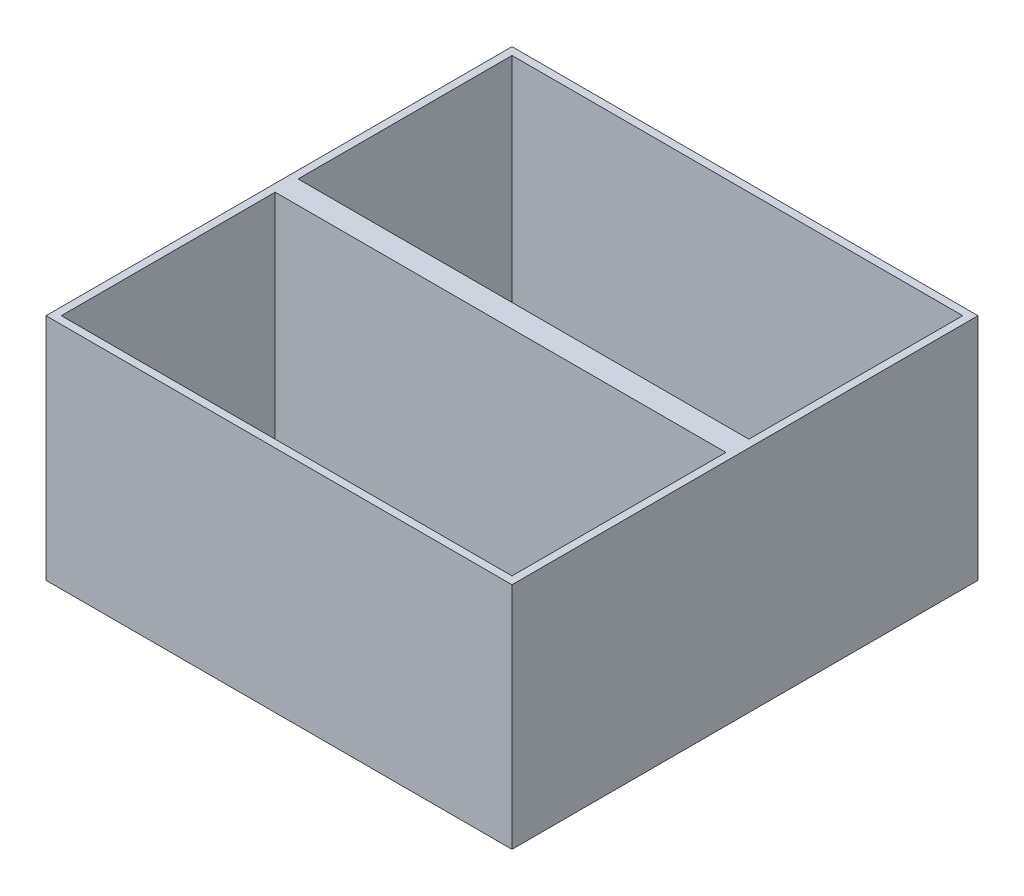
ISO-10303-21;
HEADER;
FILE_DESCRIPTION(('STEP AP214'),'2;1');
FILE_NAME('part.step','',(''),(''),'','','');
FILE_SCHEMA(('AUTOMOTIVE_DESIGN { 1 0 10303 214 1 1 1 1 }'));
ENDSEC;
DATA;
#1=APPLICATION_CONTEXT('core data for automotive mechanical design processes');
#2=APPLICATION_PROTOCOL_DEFINITION('international standard','automotive_design',2000,#1);
#3=PRODUCT_CONTEXT('',#1,'mechanical');
#4=PRODUCT('Part','Part','',(#3));
#5=PRODUCT_RELATED_PRODUCT_CATEGORY('part','',(#4));
#6=PRODUCT_DEFINITION_FORMATION('','',#4);
#7=PRODUCT_DEFINITION_CONTEXT('part definition',#1,'design');
#8=PRODUCT_DEFINITION('design','',#6,#7);
#9=PRODUCT_DEFINITION_SHAPE('','',#8);
#10=(LENGTH_UNIT() NAMED_UNIT(*) SI_UNIT(.MILLI.,.METRE.));
#11=(NAMED_UNIT(*) PLANE_ANGLE_UNIT() SI_UNIT($,.RADIAN.));
#12=(NAMED_UNIT(*) SI_UNIT($,.STERADIAN.) SOLID_ANGLE_UNIT());
#13=UNCERTAINTY_MEASURE_WITH_UNIT(LENGTH_MEASURE(1.E-05),#10,'distance_accuracy_value','');
#14=(GEOMETRIC_REPRESENTATION_CONTEXT(3) GLOBAL_UNCERTAINTY_ASSIGNED_CONTEXT((#13)) GLOBAL_UNIT_ASSIGNED_CONTEXT((#10,
#11,#12)) REPRESENTATION_CONTEXT('',''));
#15=CARTESIAN_POINT('',(0.,0.,0.));
#16=DIRECTION('',(0.,0.,1.));
#17=DIRECTION('',(1.,0.,0.));
#18=AXIS2_PLACEMENT_3D('',#15,#16,#17);
#19=CARTESIAN_POINT('',(2.5,150.,0.));
#20=DIRECTION('',(1.,0.,0.));
#21=DIRECTION('',(0.,0.,-1.));
#22=AXIS2_PLACEMENT_3D('',#19,#20,#21);
#23=PLANE('',#22);
#24=DIRECTION('',(0.,0.,1.));
#25=VECTOR('',#24,1.);
#26=CARTESIAN_POINT('',(2.5,0.,0.));
#27=LINE('',#26,#25);
#28=CARTESIAN_POINT('',(2.49999999999998,0.,-142.5));
#29=VERTEX_POINT('',#28);
#30=CARTESIAN_POINT('',(2.5,0.,-2.5));
#31=VERTEX_POINT('',#30);
#32=EDGE_CURVE('E200',#29,#31,#27,.T.);
#33=ORIENTED_EDGE('',*,*,#32,.F.);
#34=DIRECTION('',(0.,-1.,0.));
#35=VECTOR('',#34,1.);
#36=CARTESIAN_POINT('',(2.49999999999998,445.381109754839,-142.5));
#37=LINE('',#36,#35);
#38=CARTESIAN_POINT('',(2.49999999999998,150.,-142.5));
#39=VERTEX_POINT('',#38);
#40=EDGE_CURVE('E187',#39,#29,#37,.T.);
#41=ORIENTED_EDGE('',*,*,#40,.F.);
#42=DIRECTION('',(0.,0.,1.));
#43=VECTOR('',#42,1.);
#44=CARTESIAN_POINT('',(2.5,150.,0.));
#45=LINE('',#44,#43);
#46=CARTESIAN_POINT('',(2.5,150.,-2.5));
#47=VERTEX_POINT('',#46);
#48=EDGE_CURVE('E180',#39,#47,#45,.T.);
#49=ORIENTED_EDGE('',*,*,#48,.T.);
#50=DIRECTION('',(0.,-1.,0.));
#51=VECTOR('',#50,1.);
#52=CARTESIAN_POINT('',(2.5,150.,-2.5));
#53=LINE('',#52,#51);
#54=EDGE_CURVE('E221',#47,#31,#53,.T.);
#55=ORIENTED_EDGE('',*,*,#54,.T.);
#56=EDGE_LOOP('',(#33,#41,#49,#55));
#57=FACE_BOUND('',#56,.T.);
#58=ADVANCED_FACE('F63',(#57),#23,.T.);
#59=CARTESIAN_POINT('',(297.5,150.,0.));
#60=DIRECTION('',(-1.,0.,0.));
#61=DIRECTION('',(0.,0.,1.));
#62=AXIS2_PLACEMENT_3D('',#59,#60,#61);
#63=PLANE('',#62);
#64=DIRECTION('',(0.,0.,-1.));
#65=VECTOR('',#64,1.);
#66=CARTESIAN_POINT('',(297.5,150.,0.));
#67=LINE('',#66,#65);
#68=CARTESIAN_POINT('',(297.5,150.,-2.5));
#69=VERTEX_POINT('',#68);
#70=CARTESIAN_POINT('',(297.5,150.,-142.5));
#71=VERTEX_POINT('',#70);
#72=EDGE_CURVE('E189',#69,#71,#67,.T.);
#73=ORIENTED_EDGE('',*,*,#72,.T.);
#74=DIRECTION('',(0.,-1.,0.));
#75=VECTOR('',#74,1.);
#76=CARTESIAN_POINT('',(297.5,445.381109754839,-142.5));
#77=LINE('',#76,#75);
#78=CARTESIAN_POINT('',(297.5,0.,-142.5));
#79=VERTEX_POINT('',#78);
#80=EDGE_CURVE('E404',#71,#79,#77,.T.);
#81=ORIENTED_EDGE('',*,*,#80,.T.);
#82=DIRECTION('',(0.,0.,-1.));
#83=VECTOR('',#82,1.);
#84=CARTESIAN_POINT('',(297.5,0.,0.));
#85=LINE('',#84,#83);
#86=CARTESIAN_POINT('',(297.5,0.,-2.5));
#87=VERTEX_POINT('',#86);
#88=EDGE_CURVE('E205',#87,#79,#85,.T.);
#89=ORIENTED_EDGE('',*,*,#88,.F.);
#90=DIRECTION('',(0.,-1.,0.));
#91=VECTOR('',#90,1.);
#92=CARTESIAN_POINT('',(297.5,150.,-2.5));
#93=LINE('',#92,#91);
#94=EDGE_CURVE('E218',#69,#87,#93,.T.);
#95=ORIENTED_EDGE('',*,*,#94,.F.);
#96=EDGE_LOOP('',(#73,#81,#89,#95));
#97=FACE_BOUND('',#96,.T.);
#98=ADVANCED_FACE('F288',(#97),#63,.T.);
#99=CARTESIAN_POINT('',(0.,150.,0.));
#100=DIRECTION('',(0.,1.,0.));
#101=DIRECTION('',(0.,0.,1.));
#102=AXIS2_PLACEMENT_3D('',#99,#100,#101);
#103=PLANE('',#102);
#104=DIRECTION('',(1.,0.,0.));
#105=VECTOR('',#104,1.);
#106=CARTESIAN_POINT('',(2.49999999999998,150.,-157.5));
#107=LINE('',#106,#105);
#108=CARTESIAN_POINT('',(2.49999999999998,150.,-157.5));
#109=VERTEX_POINT('',#108);
#110=CARTESIAN_POINT('',(297.5,150.,-157.5));
#111=VERTEX_POINT('',#110);
#112=EDGE_CURVE('E152',#109,#111,#107,.T.);
#113=ORIENTED_EDGE('',*,*,#112,.F.);
#114=CARTESIAN_POINT('',(2.49999999999996,150.,-297.5));
#115=VERTEX_POINT('',#114);
#116=EDGE_CURVE('E158',#115,#109,#45,.T.);
#117=ORIENTED_EDGE('',*,*,#116,.F.);
#118=DIRECTION('',(-1.,0.,0.));
#119=VECTOR('',#118,1.);
#120=CARTESIAN_POINT('',(-1.10097116608661E-13,150.,-297.5));
#121=LINE('',#120,#119);
#122=CARTESIAN_POINT('',(297.5,150.,-297.5));
#123=VERTEX_POINT('',#122);
#124=EDGE_CURVE('E193',#123,#115,#121,.T.);
#125=ORIENTED_EDGE('',*,*,#124,.F.);
#126=EDGE_CURVE('E159',#111,#123,#67,.T.);
#127=ORIENTED_EDGE('',*,*,#126,.F.);
#128=EDGE_LOOP('',(#113,#117,#125,#127));
#129=FACE_BOUND('',#128,.T.);
#130=DIRECTION('',(0.,0.,1.));
#131=VECTOR('',#130,1.);
#132=CARTESIAN_POINT('',(-2.5,150.,0.));
#133=LINE('',#132,#131);
#134=CARTESIAN_POINT('',(-2.50000000000004,150.,-302.5));
#135=VERTEX_POINT('',#134);
#136=CARTESIAN_POINT('',(-2.5,150.,2.5));
#137=VERTEX_POINT('',#136);
#138=EDGE_CURVE('E226',#135,#137,#133,.T.);
#139=ORIENTED_EDGE('',*,*,#138,.T.);
#140=DIRECTION('',(1.,0.,0.));
#141=VECTOR('',#140,1.);
#142=CARTESIAN_POINT('',(0.,150.,2.5));
#143=LINE('',#142,#141);
#144=CARTESIAN_POINT('',(302.5,150.,2.5));
#145=VERTEX_POINT('',#144);
#146=EDGE_CURVE('E230',#137,#145,#143,.T.);
#147=ORIENTED_EDGE('',*,*,#146,.T.);
#148=DIRECTION('',(0.,0.,-1.));
#149=VECTOR('',#148,1.);
#150=CARTESIAN_POINT('',(302.5,150.,0.));
#151=LINE('',#150,#149);
#152=CARTESIAN_POINT('',(302.5,150.,-302.5));
#153=VERTEX_POINT('',#152);
#154=EDGE_CURVE('E234',#145,#153,#151,.T.);
#155=ORIENTED_EDGE('',*,*,#154,.T.);
#156=DIRECTION('',(-1.,0.,0.));
#157=VECTOR('',#156,1.);
#158=CARTESIAN_POINT('',(-1.1194748831637E-13,150.,-302.5));
#159=LINE('',#158,#157);
#160=EDGE_CURVE('E237',#153,#135,#159,.T.);
#161=ORIENTED_EDGE('',*,*,#160,.T.);
#162=EDGE_LOOP('',(#139,#147,#155,#161));
#163=FACE_BOUND('',#162,.T.);
#164=DIRECTION('',(1.,0.,0.));
#165=VECTOR('',#164,1.);
#166=CARTESIAN_POINT('',(0.,150.,-2.5));
#167=LINE('',#166,#165);
#168=EDGE_CURVE('E179',#47,#69,#167,.T.);
#169=ORIENTED_EDGE('',*,*,#168,.F.);
#170=ORIENTED_EDGE('',*,*,#48,.F.);
#171=DIRECTION('',(1.,0.,0.));
#172=VECTOR('',#171,1.);
#173=CARTESIAN_POINT('',(2.49999999999998,150.,-142.5));
#174=LINE('',#173,#172);
#175=EDGE_CURVE('E79',#39,#71,#174,.T.);
#176=ORIENTED_EDGE('',*,*,#175,.T.);
#177=ORIENTED_EDGE('',*,*,#72,.F.);
#178=EDGE_LOOP('',(#169,#170,#176,#177));
#179=FACE_BOUND('',#178,.T.);
#180=ADVANCED_FACE('F154',(#129,#163,#179),#103,.T.);
#181=CARTESIAN_POINT('',(0.,0.,0.));
#182=DIRECTION('',(0.,1.,0.));
#183=DIRECTION('',(0.,0.,1.));
#184=AXIS2_PLACEMENT_3D('',#181,#182,#183);
#185=PLANE('',#184);
#186=CARTESIAN_POINT('',(2.49999999999996,0.,-297.5));
#187=VERTEX_POINT('',#186);
#188=CARTESIAN_POINT('',(2.49999999999998,0.,-157.5));
#189=VERTEX_POINT('',#188);
#190=EDGE_CURVE('E196',#187,#189,#27,.T.);
#191=ORIENTED_EDGE('',*,*,#190,.T.);
#192=DIRECTION('',(1.,0.,0.));
#193=VECTOR('',#192,1.);
#194=CARTESIAN_POINT('',(2.49999999999998,0.,-157.5));
#195=LINE('',#194,#193);
#196=CARTESIAN_POINT('',(297.5,0.,-157.5));
#197=VERTEX_POINT('',#196);
#198=EDGE_CURVE('E169',#189,#197,#195,.T.);
#199=ORIENTED_EDGE('',*,*,#198,.T.);
#200=CARTESIAN_POINT('',(297.5,0.,-297.5));
#201=VERTEX_POINT('',#200);
#202=EDGE_CURVE('E204',#197,#201,#85,.T.);
#203=ORIENTED_EDGE('',*,*,#202,.T.);
#204=DIRECTION('',(-1.,0.,0.));
#205=VECTOR('',#204,1.);
#206=CARTESIAN_POINT('',(-1.10097116608661E-13,0.,-297.5));
#207=LINE('',#206,#205);
#208=EDGE_CURVE('E185',#201,#187,#207,.T.);
#209=ORIENTED_EDGE('',*,*,#208,.T.);
#210=EDGE_LOOP('',(#191,#199,#203,#209));
#211=FACE_BOUND('',#210,.T.);
#212=DIRECTION('',(0.,0.,1.));
#213=VECTOR('',#212,1.);
#214=CARTESIAN_POINT('',(-2.5,0.,0.));
#215=LINE('',#214,#213);
#216=CARTESIAN_POINT('',(-2.50000000000004,0.,-302.5));
#217=VERTEX_POINT('',#216);
#218=CARTESIAN_POINT('',(-2.5,0.,2.5));
#219=VERTEX_POINT('',#218);
#220=EDGE_CURVE('E225',#217,#219,#215,.T.);
#221=ORIENTED_EDGE('',*,*,#220,.F.);
#222=DIRECTION('',(-1.,0.,0.));
#223=VECTOR('',#222,1.);
#224=CARTESIAN_POINT('',(-1.1194748831637E-13,0.,-302.5));
#225=LINE('',#224,#223);
#226=CARTESIAN_POINT('',(302.5,0.,-302.5));
#227=VERTEX_POINT('',#226);
#228=EDGE_CURVE('E231',#227,#217,#225,.T.);
#229=ORIENTED_EDGE('',*,*,#228,.F.);
#230=DIRECTION('',(0.,0.,-1.));
#231=VECTOR('',#230,1.);
#232=CARTESIAN_POINT('',(302.5,0.,0.));
#233=LINE('',#232,#231);
#234=CARTESIAN_POINT('',(302.5,0.,2.5));
#235=VERTEX_POINT('',#234);
#236=EDGE_CURVE('E247',#235,#227,#233,.T.);
#237=ORIENTED_EDGE('',*,*,#236,.F.);
#238=DIRECTION('',(1.,0.,0.));
#239=VECTOR('',#238,1.);
#240=CARTESIAN_POINT('',(0.,0.,2.5));
#241=LINE('',#240,#239);
#242=EDGE_CURVE('E244',#219,#235,#241,.T.);
#243=ORIENTED_EDGE('',*,*,#242,.F.);
#244=EDGE_LOOP('',(#221,#229,#237,#243));
#245=FACE_BOUND('',#244,.T.);
#246=DIRECTION('',(1.,0.,0.));
#247=VECTOR('',#246,1.);
#248=CARTESIAN_POINT('',(2.49999999999998,0.,-142.5));
#249=LINE('',#248,#247);
#250=EDGE_CURVE('E84',#29,#79,#249,.T.);
#251=ORIENTED_EDGE('',*,*,#250,.F.);
#252=ORIENTED_EDGE('',*,*,#32,.T.);
#253=DIRECTION('',(1.,0.,0.));
#254=VECTOR('',#253,1.);
#255=CARTESIAN_POINT('',(0.,0.,-2.5));
#256=LINE('',#255,#254);
#257=EDGE_CURVE('E199',#31,#87,#256,.T.);
#258=ORIENTED_EDGE('',*,*,#257,.T.);
#259=ORIENTED_EDGE('',*,*,#88,.T.);
#260=EDGE_LOOP('',(#251,#252,#258,#259));
#261=FACE_BOUND('',#260,.T.);
#262=ADVANCED_FACE('F270',(#211,#245,#261),#185,.F.);
#263=CARTESIAN_POINT('',(-2.5,150.,0.));
#264=DIRECTION('',(1.,0.,0.));
#265=DIRECTION('',(0.,0.,-1.));
#266=AXIS2_PLACEMENT_3D('',#263,#264,#265);
#267=PLANE('',#266);
#268=ORIENTED_EDGE('',*,*,#220,.T.);
#269=DIRECTION('',(0.,-1.,0.));
#270=VECTOR('',#269,1.);
#271=CARTESIAN_POINT('',(-2.5,150.,2.5));
#272=LINE('',#271,#270);
#273=EDGE_CURVE('E12',#137,#219,#272,.T.);
#274=ORIENTED_EDGE('',*,*,#273,.F.);
#275=ORIENTED_EDGE('',*,*,#138,.F.);
#276=DIRECTION('',(0.,-1.,0.));
#277=VECTOR('',#276,1.);
#278=CARTESIAN_POINT('',(-2.50000000000004,150.,-302.5));
#279=LINE('',#278,#277);
#280=EDGE_CURVE('E240',#135,#217,#279,.T.);
#281=ORIENTED_EDGE('',*,*,#280,.T.);
#282=EDGE_LOOP('',(#268,#274,#275,#281));
#283=FACE_BOUND('',#282,.T.);
#284=ADVANCED_FACE('F65',(#283),#267,.F.);
#285=CARTESIAN_POINT('',(0.,150.,2.5));
#286=DIRECTION('',(0.,0.,-1.));
#287=DIRECTION('',(-1.,0.,0.));
#288=AXIS2_PLACEMENT_3D('',#285,#286,#287);
#289=PLANE('',#288);
#290=ORIENTED_EDGE('',*,*,#242,.T.);
#291=DIRECTION('',(0.,-1.,0.));
#292=VECTOR('',#291,1.);
#293=CARTESIAN_POINT('',(302.5,150.,2.5));
#294=LINE('',#293,#292);
#295=EDGE_CURVE('E72',#145,#235,#294,.T.);
#296=ORIENTED_EDGE('',*,*,#295,.F.);
#297=ORIENTED_EDGE('',*,*,#146,.F.);
#298=ORIENTED_EDGE('',*,*,#273,.T.);
#299=EDGE_LOOP('',(#290,#296,#297,#298));
#300=FACE_BOUND('',#299,.T.);
#301=ADVANCED_FACE('F280',(#300),#289,.F.);
#302=CARTESIAN_POINT('',(302.5,150.,0.));
#303=DIRECTION('',(-1.,0.,0.));
#304=DIRECTION('',(0.,0.,1.));
#305=AXIS2_PLACEMENT_3D('',#302,#303,#304);
#306=PLANE('',#305);
#307=ORIENTED_EDGE('',*,*,#236,.T.);
#308=DIRECTION('',(0.,-1.,0.));
#309=VECTOR('',#308,1.);
#310=CARTESIAN_POINT('',(302.5,150.,-302.5));
#311=LINE('',#310,#309);
#312=EDGE_CURVE('E255',#153,#227,#311,.T.);
#313=ORIENTED_EDGE('',*,*,#312,.F.);
#314=ORIENTED_EDGE('',*,*,#154,.F.);
#315=ORIENTED_EDGE('',*,*,#295,.T.);
#316=EDGE_LOOP('',(#307,#313,#314,#315));
#317=FACE_BOUND('',#316,.T.);
#318=ADVANCED_FACE('F264',(#317),#306,.F.);
#319=CARTESIAN_POINT('',(-1.1194748831637E-13,150.,-302.5));
#320=DIRECTION('',(0.,0.,1.));
#321=DIRECTION('',(1.,0.,0.));
#322=AXIS2_PLACEMENT_3D('',#319,#320,#321);
#323=PLANE('',#322);
#324=ORIENTED_EDGE('',*,*,#228,.T.);
#325=ORIENTED_EDGE('',*,*,#280,.F.);
#326=ORIENTED_EDGE('',*,*,#160,.F.);
#327=ORIENTED_EDGE('',*,*,#312,.T.);
#328=EDGE_LOOP('',(#324,#325,#326,#327));
#329=FACE_BOUND('',#328,.T.);
#330=ADVANCED_FACE('F274',(#329),#323,.F.);
#331=DIRECTION('',(0.,-1.,0.));
#332=VECTOR('',#331,1.);
#333=CARTESIAN_POINT('',(2.49999999999998,445.381109754839,-157.5));
#334=LINE('',#333,#332);
#335=EDGE_CURVE('E164',#109,#189,#334,.T.);
#336=ORIENTED_EDGE('',*,*,#335,.T.);
#337=ORIENTED_EDGE('',*,*,#190,.F.);
#338=DIRECTION('',(0.,-1.,0.));
#339=VECTOR('',#338,1.);
#340=CARTESIAN_POINT('',(2.49999999999996,150.,-297.5));
#341=LINE('',#340,#339);
#342=EDGE_CURVE('E177',#115,#187,#341,.T.);
#343=ORIENTED_EDGE('',*,*,#342,.F.);
#344=ORIENTED_EDGE('',*,*,#116,.T.);
#345=EDGE_LOOP('',(#336,#337,#343,#344));
#346=FACE_BOUND('',#345,.T.);
#347=ADVANCED_FACE('F175',(#346),#23,.T.);
#348=CARTESIAN_POINT('',(0.,150.,-2.5));
#349=DIRECTION('',(0.,0.,-1.));
#350=DIRECTION('',(-1.,0.,0.));
#351=AXIS2_PLACEMENT_3D('',#348,#349,#350);
#352=PLANE('',#351);
#353=ORIENTED_EDGE('',*,*,#257,.F.);
#354=ORIENTED_EDGE('',*,*,#54,.F.);
#355=ORIENTED_EDGE('',*,*,#168,.T.);
#356=ORIENTED_EDGE('',*,*,#94,.T.);
#357=EDGE_LOOP('',(#353,#354,#355,#356));
#358=FACE_BOUND('',#357,.T.);
#359=ADVANCED_FACE('F301',(#358),#352,.T.);
#360=DIRECTION('',(0.,-1.,0.));
#361=VECTOR('',#360,1.);
#362=CARTESIAN_POINT('',(297.5,445.381109754839,-157.5));
#363=LINE('',#362,#361);
#364=EDGE_CURVE('E163',#111,#197,#363,.T.);
#365=ORIENTED_EDGE('',*,*,#364,.F.);
#366=ORIENTED_EDGE('',*,*,#126,.T.);
#367=DIRECTION('',(0.,-1.,0.));
#368=VECTOR('',#367,1.);
#369=CARTESIAN_POINT('',(297.5,150.,-297.5));
#370=LINE('',#369,#368);
#371=EDGE_CURVE('E214',#123,#201,#370,.T.);
#372=ORIENTED_EDGE('',*,*,#371,.T.);
#373=ORIENTED_EDGE('',*,*,#202,.F.);
#374=EDGE_LOOP('',(#365,#366,#372,#373));
#375=FACE_BOUND('',#374,.T.);
#376=ADVANCED_FACE('F296',(#375),#63,.T.);
#377=CARTESIAN_POINT('',(-1.10097116608661E-13,150.,-297.5));
#378=DIRECTION('',(0.,0.,1.));
#379=DIRECTION('',(1.,0.,0.));
#380=AXIS2_PLACEMENT_3D('',#377,#378,#379);
#381=PLANE('',#380);
#382=ORIENTED_EDGE('',*,*,#208,.F.);
#383=ORIENTED_EDGE('',*,*,#371,.F.);
#384=ORIENTED_EDGE('',*,*,#124,.T.);
#385=ORIENTED_EDGE('',*,*,#342,.T.);
#386=EDGE_LOOP('',(#382,#383,#384,#385));
#387=FACE_BOUND('',#386,.T.);
#388=ADVANCED_FACE('F355',(#387),#381,.T.);
#389=CARTESIAN_POINT('',(2.49999999999998,445.381109754839,-157.5));
#390=DIRECTION('',(0.,0.,-1.));
#391=DIRECTION('',(-1.,0.,0.));
#392=AXIS2_PLACEMENT_3D('',#389,#390,#391);
#393=PLANE('',#392);
#394=ORIENTED_EDGE('',*,*,#335,.F.);
#395=ORIENTED_EDGE('',*,*,#112,.T.);
#396=ORIENTED_EDGE('',*,*,#364,.T.);
#397=ORIENTED_EDGE('',*,*,#198,.F.);
#398=EDGE_LOOP('',(#394,#395,#396,#397));
#399=FACE_BOUND('',#398,.T.);
#400=ADVANCED_FACE('F167',(#399),#393,.T.);
#401=CARTESIAN_POINT('',(2.49999999999998,445.381109754839,-142.5));
#402=DIRECTION('',(0.,0.,-1.));
#403=DIRECTION('',(-1.,0.,0.));
#404=AXIS2_PLACEMENT_3D('',#401,#402,#403);
#405=PLANE('',#404);
#406=ORIENTED_EDGE('',*,*,#175,.F.);
#407=ORIENTED_EDGE('',*,*,#40,.T.);
#408=ORIENTED_EDGE('',*,*,#250,.T.);
#409=ORIENTED_EDGE('',*,*,#80,.F.);
#410=EDGE_LOOP('',(#406,#407,#408,#409));
#411=FACE_BOUND('',#410,.T.);
#412=ADVANCED_FACE('F387',(#411),#405,.F.);
#413=CLOSED_SHELL('',(#58,#98,#180,#262,#284,#301,#318,#330,#347,#359,#376,#388,#400,#412));
#414=MANIFOLD_SOLID_BREP('B2',#413);
#415=ADVANCED_BREP_SHAPE_REPRESENTATION('',(#18,#414),#14);
#416=SHAPE_DEFINITION_REPRESENTATION(#9,#415);
ENDSEC;
END-ISO-10303-21;
